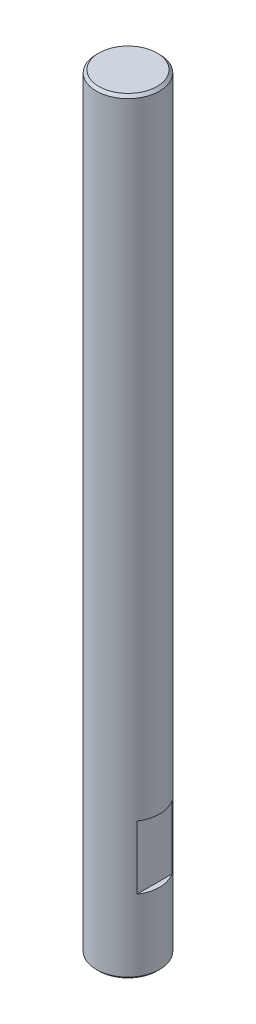
ISO-10303-21;
HEADER;
FILE_DESCRIPTION(('STEP AP214'),'2;1');
FILE_NAME('part.step','',(''),(''),'','','');
FILE_SCHEMA(('AUTOMOTIVE_DESIGN { 1 0 10303 214 1 1 1 1 }'));
ENDSEC;
DATA;
#1=APPLICATION_CONTEXT('core data for automotive mechanical design processes');
#2=APPLICATION_PROTOCOL_DEFINITION('international standard','automotive_design',2000,#1);
#3=PRODUCT_CONTEXT('',#1,'mechanical');
#4=PRODUCT('Part','Part','',(#3));
#5=PRODUCT_RELATED_PRODUCT_CATEGORY('part','',(#4));
#6=PRODUCT_DEFINITION_FORMATION('','',#4);
#7=PRODUCT_DEFINITION_CONTEXT('part definition',#1,'design');
#8=PRODUCT_DEFINITION('design','',#6,#7);
#9=PRODUCT_DEFINITION_SHAPE('','',#8);
#10=(LENGTH_UNIT() NAMED_UNIT(*) SI_UNIT(.MILLI.,.METRE.));
#11=(NAMED_UNIT(*) PLANE_ANGLE_UNIT() SI_UNIT($,.RADIAN.));
#12=(NAMED_UNIT(*) SI_UNIT($,.STERADIAN.) SOLID_ANGLE_UNIT());
#13=UNCERTAINTY_MEASURE_WITH_UNIT(LENGTH_MEASURE(1.E-05),#10,'distance_accuracy_value','');
#14=(GEOMETRIC_REPRESENTATION_CONTEXT(3) GLOBAL_UNCERTAINTY_ASSIGNED_CONTEXT((#13)) GLOBAL_UNIT_ASSIGNED_CONTEXT((#10,
#11,#12)) REPRESENTATION_CONTEXT('',''));
#15=CARTESIAN_POINT('',(0.,0.,0.));
#16=DIRECTION('',(0.,0.,1.));
#17=DIRECTION('',(1.,0.,0.));
#18=AXIS2_PLACEMENT_3D('',#15,#16,#17);
#19=CARTESIAN_POINT('',(0.,145.,0.));
#20=DIRECTION('',(0.,-1.,0.));
#21=DIRECTION('',(0.,0.,-1.));
#22=AXIS2_PLACEMENT_3D('',#19,#20,#21);
#23=CYLINDRICAL_SURFACE('',#22,6.);
#24=DIRECTION('',(0.,-1.,0.));
#25=VECTOR('',#24,1.);
#26=CARTESIAN_POINT('',(4.99999999999999,145.,-3.31662479035542));
#27=LINE('',#26,#25);
#28=CARTESIAN_POINT('',(5.00000000000001,26.,-3.31662479035539));
#29=VERTEX_POINT('',#28);
#30=CARTESIAN_POINT('',(5.00000000000001,14.,-3.31662479035542));
#31=VERTEX_POINT('',#30);
#32=EDGE_CURVE('E49',#29,#31,#27,.T.);
#33=ORIENTED_EDGE('',*,*,#32,.T.);
#34=CARTESIAN_POINT('',(0.,14.,0.));
#35=DIRECTION('',(0.,-1.,0.));
#36=DIRECTION('',(0.,0.,-1.));
#37=AXIS2_PLACEMENT_3D('',#34,#35,#36);
#38=CIRCLE('',#37,6.);
#39=CARTESIAN_POINT('',(5.00000000000001,14.,3.31662479035541));
#40=VERTEX_POINT('',#39);
#41=EDGE_CURVE('E11',#31,#40,#38,.T.);
#42=ORIENTED_EDGE('',*,*,#41,.T.);
#43=DIRECTION('',(0.,-1.,0.));
#44=VECTOR('',#43,1.);
#45=CARTESIAN_POINT('',(4.99999999999999,145.,3.31662479035542));
#46=LINE('',#45,#44);
#47=CARTESIAN_POINT('',(5.00000000000001,26.,3.31662479035539));
#48=VERTEX_POINT('',#47);
#49=EDGE_CURVE('E62',#40,#48,#46,.F.);
#50=ORIENTED_EDGE('',*,*,#49,.T.);
#51=CARTESIAN_POINT('',(0.,26.,0.));
#52=DIRECTION('',(0.,1.,0.));
#53=DIRECTION('',(0.,0.,1.));
#54=AXIS2_PLACEMENT_3D('',#51,#52,#53);
#55=CIRCLE('',#54,6.);
#56=EDGE_CURVE('E69',#48,#29,#55,.T.);
#57=ORIENTED_EDGE('',*,*,#56,.T.);
#58=EDGE_LOOP('',(#33,#42,#50,#57));
#59=FACE_BOUND('',#58,.T.);
#60=CARTESIAN_POINT('',(0.,0.499999999999973,0.));
#61=DIRECTION('',(0.,1.,0.));
#62=DIRECTION('',(0.,0.,1.));
#63=AXIS2_PLACEMENT_3D('',#60,#61,#62);
#64=CIRCLE('',#63,6.);
#65=CARTESIAN_POINT('',(0.,0.499999999999973,6.));
#66=VERTEX_POINT('',#65);
#67=EDGE_CURVE('E87',#66,#66,#64,.T.);
#68=ORIENTED_EDGE('',*,*,#67,.T.);
#69=EDGE_LOOP('',(#68));
#70=FACE_BOUND('',#69,.T.);
#71=CARTESIAN_POINT('',(0.,144.5,0.));
#72=DIRECTION('',(0.,1.,0.));
#73=DIRECTION('',(0.,0.,1.));
#74=AXIS2_PLACEMENT_3D('',#71,#72,#73);
#75=CIRCLE('',#74,6.);
#76=CARTESIAN_POINT('',(0.,144.5,6.));
#77=VERTEX_POINT('',#76);
#78=EDGE_CURVE('E89',#77,#77,#75,.F.);
#79=ORIENTED_EDGE('',*,*,#78,.T.);
#80=EDGE_LOOP('',(#79));
#81=FACE_BOUND('',#80,.T.);
#82=ADVANCED_FACE('F41',(#59,#70,#81),#23,.T.);
#83=CARTESIAN_POINT('',(0.,145.,0.));
#84=DIRECTION('',(0.,1.,0.));
#85=DIRECTION('',(0.,0.,1.));
#86=AXIS2_PLACEMENT_3D('',#83,#84,#85);
#87=PLANE('',#86);
#88=CARTESIAN_POINT('',(0.,145.,0.));
#89=DIRECTION('',(0.,1.,0.));
#90=DIRECTION('',(0.,0.,1.));
#91=AXIS2_PLACEMENT_3D('',#88,#89,#90);
#92=CIRCLE('',#91,5.50000000000001);
#93=CARTESIAN_POINT('',(0.,145.,5.50000000000001));
#94=VERTEX_POINT('',#93);
#95=EDGE_CURVE('E74',#94,#94,#92,.T.);
#96=ORIENTED_EDGE('',*,*,#95,.T.);
#97=EDGE_LOOP('',(#96));
#98=FACE_BOUND('',#97,.T.);
#99=ADVANCED_FACE('F104',(#98),#87,.T.);
#100=CARTESIAN_POINT('',(0.,0.,0.));
#101=DIRECTION('',(0.,1.,0.));
#102=DIRECTION('',(0.,0.,1.));
#103=AXIS2_PLACEMENT_3D('',#100,#101,#102);
#104=PLANE('',#103);
#105=CARTESIAN_POINT('',(0.,0.,0.));
#106=DIRECTION('',(0.,1.,0.));
#107=DIRECTION('',(0.,0.,1.));
#108=AXIS2_PLACEMENT_3D('',#105,#106,#107);
#109=CIRCLE('',#108,5.50000000000003);
#110=CARTESIAN_POINT('',(0.,0.,5.50000000000003));
#111=VERTEX_POINT('',#110);
#112=EDGE_CURVE('E83',#111,#111,#109,.F.);
#113=ORIENTED_EDGE('',*,*,#112,.T.);
#114=EDGE_LOOP('',(#113));
#115=FACE_BOUND('',#114,.T.);
#116=ADVANCED_FACE('F109',(#115),#104,.F.);
#117=CARTESIAN_POINT('',(0.,0.499999999999973,0.));
#118=DIRECTION('',(0.,1.,0.));
#119=DIRECTION('',(0.,0.,1.));
#120=AXIS2_PLACEMENT_3D('',#117,#118,#119);
#121=CONICAL_SURFACE('',#120,6.,0.785398163397443);
#122=ORIENTED_EDGE('',*,*,#112,.F.);
#123=EDGE_LOOP('',(#122));
#124=FACE_BOUND('',#123,.T.);
#125=ORIENTED_EDGE('',*,*,#67,.F.);
#126=EDGE_LOOP('',(#125));
#127=FACE_BOUND('',#126,.T.);
#128=ADVANCED_FACE('F103',(#124,#127),#121,.T.);
#129=CARTESIAN_POINT('',(0.,145.,0.));
#130=DIRECTION('',(0.,-1.,0.));
#131=DIRECTION('',(0.,0.,-1.));
#132=AXIS2_PLACEMENT_3D('',#129,#130,#131);
#133=CONICAL_SURFACE('',#132,5.50000000000001,0.785398163397444);
#134=ORIENTED_EDGE('',*,*,#78,.F.);
#135=EDGE_LOOP('',(#134));
#136=FACE_BOUND('',#135,.T.);
#137=ORIENTED_EDGE('',*,*,#95,.F.);
#138=EDGE_LOOP('',(#137));
#139=FACE_BOUND('',#138,.T.);
#140=ADVANCED_FACE('F42',(#136,#139),#133,.T.);
#141=CARTESIAN_POINT('',(6.00000000000005,14.,-6.));
#142=DIRECTION('',(0.,-1.,0.));
#143=DIRECTION('',(0.,0.,-1.));
#144=AXIS2_PLACEMENT_3D('',#141,#142,#143);
#145=PLANE('',#144);
#146=DIRECTION('',(0.,0.,1.));
#147=VECTOR('',#146,1.);
#148=CARTESIAN_POINT('',(5.00000000000001,14.,-6.));
#149=LINE('',#148,#147);
#150=EDGE_CURVE('E80',#31,#40,#149,.T.);
#151=ORIENTED_EDGE('',*,*,#150,.T.);
#152=ORIENTED_EDGE('',*,*,#41,.F.);
#153=EDGE_LOOP('',(#151,#152));
#154=FACE_BOUND('',#153,.T.);
#155=ADVANCED_FACE('F94',(#154),#145,.F.);
#156=CARTESIAN_POINT('',(5.00000000000001,26.,-6.));
#157=DIRECTION('',(-1.,0.,0.));
#158=DIRECTION('',(0.,-1.,0.));
#159=AXIS2_PLACEMENT_3D('',#156,#157,#158);
#160=PLANE('',#159);
#161=DIRECTION('',(0.,0.,1.));
#162=VECTOR('',#161,1.);
#163=CARTESIAN_POINT('',(5.00000000000001,26.,-6.));
#164=LINE('',#163,#162);
#165=EDGE_CURVE('E57',#29,#48,#164,.T.);
#166=ORIENTED_EDGE('',*,*,#165,.T.);
#167=ORIENTED_EDGE('',*,*,#49,.F.);
#168=ORIENTED_EDGE('',*,*,#150,.F.);
#169=ORIENTED_EDGE('',*,*,#32,.F.);
#170=EDGE_LOOP('',(#166,#167,#168,#169));
#171=FACE_BOUND('',#170,.T.);
#172=ADVANCED_FACE('F76',(#171),#160,.F.);
#173=CARTESIAN_POINT('',(6.00000000000005,26.,-6.));
#174=DIRECTION('',(0.,1.,0.));
#175=DIRECTION('',(0.,0.,1.));
#176=AXIS2_PLACEMENT_3D('',#173,#174,#175);
#177=PLANE('',#176);
#178=ORIENTED_EDGE('',*,*,#165,.F.);
#179=ORIENTED_EDGE('',*,*,#56,.F.);
#180=EDGE_LOOP('',(#178,#179));
#181=FACE_BOUND('',#180,.T.);
#182=ADVANCED_FACE('F72',(#181),#177,.F.);
#183=CLOSED_SHELL('',(#82,#99,#116,#128,#140,#155,#172,#182));
#184=MANIFOLD_SOLID_BREP('B2',#183);
#185=ADVANCED_BREP_SHAPE_REPRESENTATION('',(#18,#184),#14);
#186=SHAPE_DEFINITION_REPRESENTATION(#9,#185);
ENDSEC;
END-ISO-10303-21;
